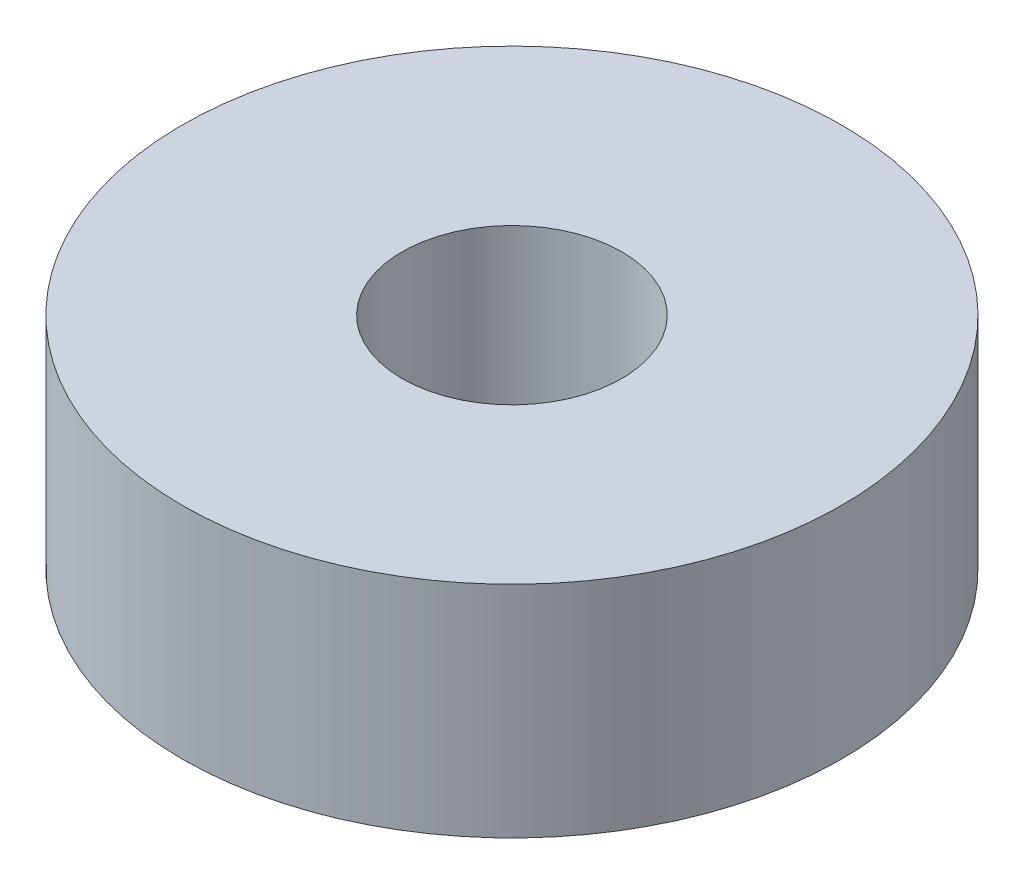
ISO-10303-21;
HEADER;
FILE_DESCRIPTION(('STEP AP214'),'2;1');
FILE_NAME('part.step','',(''),(''),'','','');
FILE_SCHEMA(('AUTOMOTIVE_DESIGN { 1 0 10303 214 1 1 1 1 }'));
ENDSEC;
DATA;
#1=APPLICATION_CONTEXT('core data for automotive mechanical design processes');
#2=APPLICATION_PROTOCOL_DEFINITION('international standard','automotive_design',2000,#1);
#3=PRODUCT_CONTEXT('',#1,'mechanical');
#4=PRODUCT('Part','Part','',(#3));
#5=PRODUCT_RELATED_PRODUCT_CATEGORY('part','',(#4));
#6=PRODUCT_DEFINITION_FORMATION('','',#4);
#7=PRODUCT_DEFINITION_CONTEXT('part definition',#1,'design');
#8=PRODUCT_DEFINITION('design','',#6,#7);
#9=PRODUCT_DEFINITION_SHAPE('','',#8);
#10=(LENGTH_UNIT() NAMED_UNIT(*) SI_UNIT(.MILLI.,.METRE.));
#11=(NAMED_UNIT(*) PLANE_ANGLE_UNIT() SI_UNIT($,.RADIAN.));
#12=(NAMED_UNIT(*) SI_UNIT($,.STERADIAN.) SOLID_ANGLE_UNIT());
#13=UNCERTAINTY_MEASURE_WITH_UNIT(LENGTH_MEASURE(1.E-05),#10,'distance_accuracy_value','');
#14=(GEOMETRIC_REPRESENTATION_CONTEXT(3) GLOBAL_UNCERTAINTY_ASSIGNED_CONTEXT((#13)) GLOBAL_UNIT_ASSIGNED_CONTEXT((#10,
#11,#12)) REPRESENTATION_CONTEXT('',''));
#15=CARTESIAN_POINT('',(0.,0.,0.));
#16=DIRECTION('',(0.,0.,1.));
#17=DIRECTION('',(1.,0.,0.));
#18=AXIS2_PLACEMENT_3D('',#15,#16,#17);
#19=CARTESIAN_POINT('',(0.,4.,0.));
#20=DIRECTION('',(0.,1.,0.));
#21=DIRECTION('',(0.,0.,1.));
#22=AXIS2_PLACEMENT_3D('',#19,#20,#21);
#23=PLANE('',#22);
#24=CARTESIAN_POINT('',(0.,4.,0.));
#25=DIRECTION('',(0.,1.,0.));
#26=DIRECTION('',(0.,0.,1.));
#27=AXIS2_PLACEMENT_3D('',#24,#25,#26);
#28=CIRCLE('',#27,6.);
#29=CARTESIAN_POINT('',(0.,4.,6.));
#30=VERTEX_POINT('',#29);
#31=EDGE_CURVE('E10',#30,#30,#28,.T.);
#32=ORIENTED_EDGE('',*,*,#31,.T.);
#33=EDGE_LOOP('',(#32));
#34=FACE_BOUND('',#33,.T.);
#35=CARTESIAN_POINT('',(0.,4.,0.));
#36=DIRECTION('',(0.,1.,0.));
#37=DIRECTION('',(0.,0.,1.));
#38=AXIS2_PLACEMENT_3D('',#35,#36,#37);
#39=CIRCLE('',#38,2.);
#40=CARTESIAN_POINT('',(0.,4.,2.));
#41=VERTEX_POINT('',#40);
#42=EDGE_CURVE('E42',#41,#41,#39,.T.);
#43=ORIENTED_EDGE('',*,*,#42,.F.);
#44=EDGE_LOOP('',(#43));
#45=FACE_BOUND('',#44,.T.);
#46=ADVANCED_FACE('F31',(#34,#45),#23,.T.);
#47=CARTESIAN_POINT('',(0.,0.,0.));
#48=DIRECTION('',(0.,1.,0.));
#49=DIRECTION('',(0.,0.,1.));
#50=AXIS2_PLACEMENT_3D('',#47,#48,#49);
#51=PLANE('',#50);
#52=CARTESIAN_POINT('',(0.,0.,0.));
#53=DIRECTION('',(0.,1.,0.));
#54=DIRECTION('',(0.,0.,1.));
#55=AXIS2_PLACEMENT_3D('',#52,#53,#54);
#56=CIRCLE('',#55,6.);
#57=CARTESIAN_POINT('',(0.,0.,6.));
#58=VERTEX_POINT('',#57);
#59=EDGE_CURVE('E35',#58,#58,#56,.T.);
#60=ORIENTED_EDGE('',*,*,#59,.F.);
#61=EDGE_LOOP('',(#60));
#62=FACE_BOUND('',#61,.T.);
#63=CARTESIAN_POINT('',(0.,0.,0.));
#64=DIRECTION('',(0.,1.,0.));
#65=DIRECTION('',(0.,0.,1.));
#66=AXIS2_PLACEMENT_3D('',#63,#64,#65);
#67=CIRCLE('',#66,2.);
#68=CARTESIAN_POINT('',(0.,0.,2.));
#69=VERTEX_POINT('',#68);
#70=EDGE_CURVE('E44',#69,#69,#67,.T.);
#71=ORIENTED_EDGE('',*,*,#70,.T.);
#72=EDGE_LOOP('',(#71));
#73=FACE_BOUND('',#72,.T.);
#74=ADVANCED_FACE('F54',(#62,#73),#51,.F.);
#75=CARTESIAN_POINT('',(0.,4.,0.));
#76=DIRECTION('',(0.,-1.,0.));
#77=DIRECTION('',(0.,0.,-1.));
#78=AXIS2_PLACEMENT_3D('',#75,#76,#77);
#79=CYLINDRICAL_SURFACE('',#78,6.);
#80=ORIENTED_EDGE('',*,*,#31,.F.);
#81=EDGE_LOOP('',(#80));
#82=FACE_BOUND('',#81,.T.);
#83=ORIENTED_EDGE('',*,*,#59,.T.);
#84=EDGE_LOOP('',(#83));
#85=FACE_BOUND('',#84,.T.);
#86=ADVANCED_FACE('F33',(#82,#85),#79,.T.);
#87=CARTESIAN_POINT('',(0.,4.,0.));
#88=DIRECTION('',(0.,-1.,0.));
#89=DIRECTION('',(0.,0.,-1.));
#90=AXIS2_PLACEMENT_3D('',#87,#88,#89);
#91=CYLINDRICAL_SURFACE('',#90,2.);
#92=ORIENTED_EDGE('',*,*,#42,.T.);
#93=EDGE_LOOP('',(#92));
#94=FACE_BOUND('',#93,.T.);
#95=ORIENTED_EDGE('',*,*,#70,.F.);
#96=EDGE_LOOP('',(#95));
#97=FACE_BOUND('',#96,.T.);
#98=ADVANCED_FACE('F50',(#94,#97),#91,.F.);
#99=CLOSED_SHELL('',(#46,#74,#86,#98));
#100=MANIFOLD_SOLID_BREP('B2',#99);
#101=ADVANCED_BREP_SHAPE_REPRESENTATION('',(#18,#100),#14);
#102=SHAPE_DEFINITION_REPRESENTATION(#9,#101);
ENDSEC;
END-ISO-10303-21;
